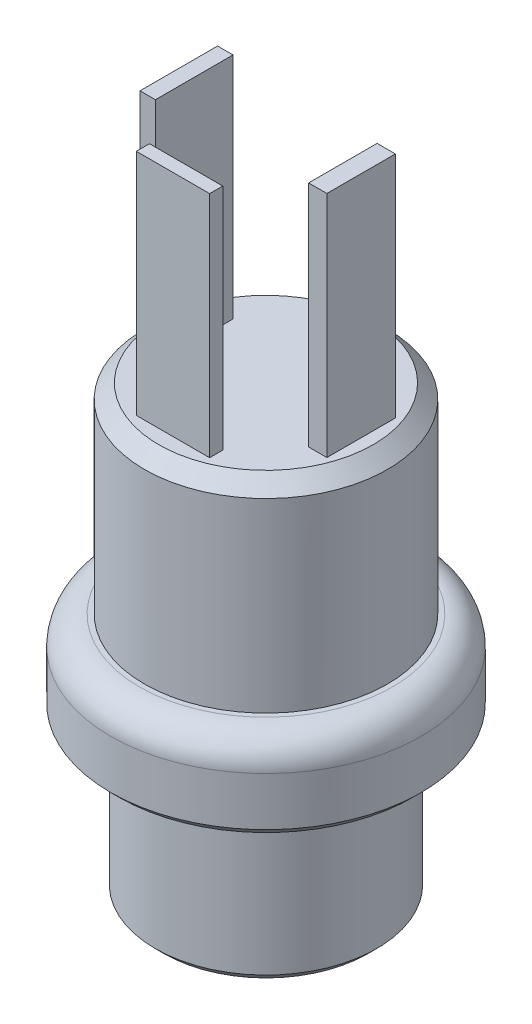
ISO-10303-21;
HEADER;
FILE_DESCRIPTION(('STEP AP214'),'2;1');
FILE_NAME('part.step','',(''),(''),'','','');
FILE_SCHEMA(('AUTOMOTIVE_DESIGN { 1 0 10303 214 1 1 1 1 }'));
ENDSEC;
DATA;
#1=APPLICATION_CONTEXT('core data for automotive mechanical design processes');
#2=APPLICATION_PROTOCOL_DEFINITION('international standard','automotive_design',2000,#1);
#3=PRODUCT_CONTEXT('',#1,'mechanical');
#4=PRODUCT('Part','Part','',(#3));
#5=PRODUCT_RELATED_PRODUCT_CATEGORY('part','',(#4));
#6=PRODUCT_DEFINITION_FORMATION('','',#4);
#7=PRODUCT_DEFINITION_CONTEXT('part definition',#1,'design');
#8=PRODUCT_DEFINITION('design','',#6,#7);
#9=PRODUCT_DEFINITION_SHAPE('','',#8);
#10=(LENGTH_UNIT() NAMED_UNIT(*) SI_UNIT(.MILLI.,.METRE.));
#11=(NAMED_UNIT(*) PLANE_ANGLE_UNIT() SI_UNIT($,.RADIAN.));
#12=(NAMED_UNIT(*) SI_UNIT($,.STERADIAN.) SOLID_ANGLE_UNIT());
#13=UNCERTAINTY_MEASURE_WITH_UNIT(LENGTH_MEASURE(1.E-05),#10,'distance_accuracy_value','');
#14=(GEOMETRIC_REPRESENTATION_CONTEXT(3) GLOBAL_UNCERTAINTY_ASSIGNED_CONTEXT((#13)) GLOBAL_UNIT_ASSIGNED_CONTEXT((#10,
#11,#12)) REPRESENTATION_CONTEXT('',''));
#15=CARTESIAN_POINT('',(0.,0.,0.));
#16=DIRECTION('',(0.,0.,1.));
#17=DIRECTION('',(1.,0.,0.));
#18=AXIS2_PLACEMENT_3D('',#15,#16,#17);
#19=CARTESIAN_POINT('',(4.25,13.,0.));
#20=DIRECTION('',(0.,-1.,0.));
#21=DIRECTION('',(0.,0.,-1.));
#22=AXIS2_PLACEMENT_3D('',#19,#20,#21);
#23=PLANE('',#22);
#24=DIRECTION('',(0.,0.,1.));
#25=VECTOR('',#24,1.);
#26=CARTESIAN_POINT('',(2.68966055315949,13.,1.19762250975551));
#27=LINE('',#26,#25);
#28=CARTESIAN_POINT('',(2.68966055315949,13.,-1.19762250975551));
#29=VERTEX_POINT('',#28);
#30=CARTESIAN_POINT('',(2.68966055315949,13.,1.19762250975551));
#31=VERTEX_POINT('',#30);
#32=EDGE_CURVE('E147',#29,#31,#27,.T.);
#33=ORIENTED_EDGE('',*,*,#32,.F.);
#34=DIRECTION('',(-1.,0.,0.));
#35=VECTOR('',#34,1.);
#36=CARTESIAN_POINT('',(3.32839255836246,13.,-1.19762250975551));
#37=LINE('',#36,#35);
#38=CARTESIAN_POINT('',(3.32839255836246,13.,-1.19762250975551));
#39=VERTEX_POINT('',#38);
#40=EDGE_CURVE('E160',#39,#29,#37,.T.);
#41=ORIENTED_EDGE('',*,*,#40,.F.);
#42=DIRECTION('',(0.,0.,-1.));
#43=VECTOR('',#42,1.);
#44=CARTESIAN_POINT('',(3.32839255836246,13.,1.19762250975551));
#45=LINE('',#44,#43);
#46=CARTESIAN_POINT('',(3.32839255836246,13.,1.19762250975551));
#47=VERTEX_POINT('',#46);
#48=EDGE_CURVE('E169',#47,#39,#45,.T.);
#49=ORIENTED_EDGE('',*,*,#48,.F.);
#50=DIRECTION('',(1.,0.,0.));
#51=VECTOR('',#50,1.);
#52=CARTESIAN_POINT('',(3.32839255836246,13.,1.19762250975551));
#53=LINE('',#52,#51);
#54=EDGE_CURVE('E150',#31,#47,#53,.T.);
#55=ORIENTED_EDGE('',*,*,#54,.F.);
#56=EDGE_LOOP('',(#33,#41,#49,#55));
#57=FACE_BOUND('',#56,.T.);
#58=CARTESIAN_POINT('',(0.,13.,0.));
#59=DIRECTION('',(0.,-1.,0.));
#60=DIRECTION('',(0.,0.,-1.));
#61=AXIS2_PLACEMENT_3D('',#58,#59,#60);
#62=CIRCLE('',#61,3.74999999999999);
#63=CARTESIAN_POINT('',(0.,13.,-3.74999999999999));
#64=VERTEX_POINT('',#63);
#65=EDGE_CURVE('E45',#64,#64,#62,.F.);
#66=ORIENTED_EDGE('',*,*,#65,.T.);
#67=EDGE_LOOP('',(#66));
#68=FACE_BOUND('',#67,.T.);
#69=DIRECTION('',(0.,0.,1.));
#70=VECTOR('',#69,1.);
#71=CARTESIAN_POINT('',(-1.28245410419665,13.,3.25354115150283));
#72=LINE('',#71,#70);
#73=CARTESIAN_POINT('',(-1.28245410419665,13.,2.79445252276316));
#74=VERTEX_POINT('',#73);
#75=CARTESIAN_POINT('',(-1.28245410419665,13.,3.25354115150283));
#76=VERTEX_POINT('',#75);
#77=EDGE_CURVE('E185',#74,#76,#72,.T.);
#78=ORIENTED_EDGE('',*,*,#77,.F.);
#79=DIRECTION('',(-1.,0.,0.));
#80=VECTOR('',#79,1.);
#81=CARTESIAN_POINT('',(1.28245410419665,13.,2.79445252276316));
#82=LINE('',#81,#80);
#83=CARTESIAN_POINT('',(1.28245410419665,13.,2.79445252276316));
#84=VERTEX_POINT('',#83);
#85=EDGE_CURVE('E190',#84,#74,#82,.T.);
#86=ORIENTED_EDGE('',*,*,#85,.F.);
#87=DIRECTION('',(0.,0.,-1.));
#88=VECTOR('',#87,1.);
#89=CARTESIAN_POINT('',(1.28245410419665,13.,3.25354115150283));
#90=LINE('',#89,#88);
#91=CARTESIAN_POINT('',(1.28245410419665,13.,3.25354115150283));
#92=VERTEX_POINT('',#91);
#93=EDGE_CURVE('E202',#92,#84,#90,.T.);
#94=ORIENTED_EDGE('',*,*,#93,.F.);
#95=DIRECTION('',(1.,0.,0.));
#96=VECTOR('',#95,1.);
#97=CARTESIAN_POINT('',(1.28245410419665,13.,3.25354115150283));
#98=LINE('',#97,#96);
#99=EDGE_CURVE('E199',#76,#92,#98,.T.);
#100=ORIENTED_EDGE('',*,*,#99,.F.);
#101=EDGE_LOOP('',(#78,#86,#94,#100));
#102=FACE_BOUND('',#101,.T.);
#103=DIRECTION('',(0.,0.,1.));
#104=VECTOR('',#103,1.);
#105=CARTESIAN_POINT('',(-3.04894730608615,13.,1.3573055110563));
#106=LINE('',#105,#104);
#107=CARTESIAN_POINT('',(-3.04894730608615,13.,-1.3573055110563));
#108=VERTEX_POINT('',#107);
#109=CARTESIAN_POINT('',(-3.04894730608615,13.,1.3573055110563));
#110=VERTEX_POINT('',#109);
#111=EDGE_CURVE('E146',#108,#110,#106,.T.);
#112=ORIENTED_EDGE('',*,*,#111,.F.);
#113=DIRECTION('',(-1.,0.,0.));
#114=VECTOR('',#113,1.);
#115=CARTESIAN_POINT('',(-2.51001717669614,13.,-1.3573055110563));
#116=LINE('',#115,#114);
#117=CARTESIAN_POINT('',(-2.51001717669614,13.,-1.3573055110563));
#118=VERTEX_POINT('',#117);
#119=EDGE_CURVE('E143',#118,#108,#116,.T.);
#120=ORIENTED_EDGE('',*,*,#119,.F.);
#121=DIRECTION('',(0.,0.,-1.));
#122=VECTOR('',#121,1.);
#123=CARTESIAN_POINT('',(-2.51001717669614,13.,1.3573055110563));
#124=LINE('',#123,#122);
#125=CARTESIAN_POINT('',(-2.51001717669614,13.,1.3573055110563));
#126=VERTEX_POINT('',#125);
#127=EDGE_CURVE('E57',#126,#118,#124,.T.);
#128=ORIENTED_EDGE('',*,*,#127,.F.);
#129=DIRECTION('',(1.,0.,0.));
#130=VECTOR('',#129,1.);
#131=CARTESIAN_POINT('',(-2.51001717669614,13.,1.3573055110563));
#132=LINE('',#131,#130);
#133=EDGE_CURVE('E52',#110,#126,#132,.T.);
#134=ORIENTED_EDGE('',*,*,#133,.F.);
#135=EDGE_LOOP('',(#112,#120,#128,#134));
#136=FACE_BOUND('',#135,.T.);
#137=ADVANCED_FACE('F36',(#57,#68,#102,#136),#23,.F.);
#138=CARTESIAN_POINT('',(0.,0.,0.));
#139=DIRECTION('',(0.,1.,0.));
#140=DIRECTION('',(0.,0.,1.));
#141=AXIS2_PLACEMENT_3D('',#138,#139,#140);
#142=CYLINDRICAL_SURFACE('',#141,1.00000000000006);
#143=CARTESIAN_POINT('',(0.,1.,0.));
#144=DIRECTION('',(0.,1.,0.));
#145=DIRECTION('',(0.,0.,1.));
#146=AXIS2_PLACEMENT_3D('',#143,#144,#145);
#147=CIRCLE('',#146,1.00000000000006);
#148=CARTESIAN_POINT('',(0.,1.,1.00000000000006));
#149=VERTEX_POINT('',#148);
#150=EDGE_CURVE('E230',#149,#149,#147,.T.);
#151=ORIENTED_EDGE('',*,*,#150,.T.);
#152=EDGE_LOOP('',(#151));
#153=FACE_BOUND('',#152,.T.);
#154=CARTESIAN_POINT('',(0.,6.,0.));
#155=DIRECTION('',(0.,1.,0.));
#156=DIRECTION('',(0.,0.,1.));
#157=AXIS2_PLACEMENT_3D('',#154,#155,#156);
#158=CIRCLE('',#157,1.);
#159=CARTESIAN_POINT('',(0.,6.,1.));
#160=VERTEX_POINT('',#159);
#161=EDGE_CURVE('E227',#160,#160,#158,.T.);
#162=ORIENTED_EDGE('',*,*,#161,.F.);
#163=EDGE_LOOP('',(#162));
#164=FACE_BOUND('',#163,.T.);
#165=ADVANCED_FACE('F276',(#153,#164),#142,.T.);
#166=CARTESIAN_POINT('',(1.,6.,0.));
#167=DIRECTION('',(0.,1.,0.));
#168=DIRECTION('',(0.,0.,1.));
#169=AXIS2_PLACEMENT_3D('',#166,#167,#168);
#170=PLANE('',#169);
#171=CARTESIAN_POINT('',(0.,6.,0.));
#172=DIRECTION('',(0.,1.,0.));
#173=DIRECTION('',(0.,0.,1.));
#174=AXIS2_PLACEMENT_3D('',#171,#172,#173);
#175=CIRCLE('',#174,2.75);
#176=CARTESIAN_POINT('',(0.,6.,2.75));
#177=VERTEX_POINT('',#176);
#178=EDGE_CURVE('E224',#177,#177,#175,.T.);
#179=ORIENTED_EDGE('',*,*,#178,.F.);
#180=EDGE_LOOP('',(#179));
#181=FACE_BOUND('',#180,.T.);
#182=ORIENTED_EDGE('',*,*,#161,.T.);
#183=EDGE_LOOP('',(#182));
#184=FACE_BOUND('',#183,.T.);
#185=ADVANCED_FACE('F282',(#181,#184),#170,.F.);
#186=CARTESIAN_POINT('',(0.,0.,0.));
#187=DIRECTION('',(0.,1.,0.));
#188=DIRECTION('',(0.,0.,1.));
#189=AXIS2_PLACEMENT_3D('',#186,#187,#188);
#190=CYLINDRICAL_SURFACE('',#189,2.75);
#191=CARTESIAN_POINT('',(0.,-2.2,0.));
#192=DIRECTION('',(0.,1.,0.));
#193=DIRECTION('',(0.,0.,1.));
#194=AXIS2_PLACEMENT_3D('',#191,#192,#193);
#195=CIRCLE('',#194,2.75);
#196=CARTESIAN_POINT('',(0.,-2.2,2.75));
#197=VERTEX_POINT('',#196);
#198=EDGE_CURVE('E248',#197,#197,#195,.F.);
#199=ORIENTED_EDGE('',*,*,#198,.T.);
#200=EDGE_LOOP('',(#199));
#201=FACE_BOUND('',#200,.T.);
#202=ORIENTED_EDGE('',*,*,#178,.T.);
#203=EDGE_LOOP('',(#202));
#204=FACE_BOUND('',#203,.T.);
#205=ADVANCED_FACE('F311',(#201,#204),#190,.F.);
#206=CARTESIAN_POINT('',(2.75,-2.5,0.));
#207=DIRECTION('',(0.,1.,0.));
#208=DIRECTION('',(0.,0.,1.));
#209=AXIS2_PLACEMENT_3D('',#206,#207,#208);
#210=PLANE('',#209);
#211=CARTESIAN_POINT('',(0.,-2.5,0.));
#212=DIRECTION('',(0.,1.,0.));
#213=DIRECTION('',(0.,0.,1.));
#214=AXIS2_PLACEMENT_3D('',#211,#212,#213);
#215=CIRCLE('',#214,3.57500000000001);
#216=CARTESIAN_POINT('',(0.,-2.5,3.57500000000001));
#217=VERTEX_POINT('',#216);
#218=EDGE_CURVE('E245',#217,#217,#215,.F.);
#219=ORIENTED_EDGE('',*,*,#218,.T.);
#220=EDGE_LOOP('',(#219));
#221=FACE_BOUND('',#220,.T.);
#222=CARTESIAN_POINT('',(0.,-2.5,0.));
#223=DIRECTION('',(0.,1.,0.));
#224=DIRECTION('',(0.,0.,1.));
#225=AXIS2_PLACEMENT_3D('',#222,#223,#224);
#226=CIRCLE('',#225,3.05);
#227=CARTESIAN_POINT('',(0.,-2.5,3.05));
#228=VERTEX_POINT('',#227);
#229=EDGE_CURVE('E242',#228,#228,#226,.T.);
#230=ORIENTED_EDGE('',*,*,#229,.T.);
#231=EDGE_LOOP('',(#230));
#232=FACE_BOUND('',#231,.T.);
#233=ADVANCED_FACE('F307',(#221,#232),#210,.F.);
#234=CARTESIAN_POINT('',(0.,0.,0.));
#235=DIRECTION('',(0.,1.,0.));
#236=DIRECTION('',(0.,0.,1.));
#237=AXIS2_PLACEMENT_3D('',#234,#235,#236);
#238=CYLINDRICAL_SURFACE('',#237,3.875);
#239=CARTESIAN_POINT('',(0.,-2.20000000000001,0.));
#240=DIRECTION('',(0.,1.,0.));
#241=DIRECTION('',(0.,0.,1.));
#242=AXIS2_PLACEMENT_3D('',#239,#240,#241);
#243=CIRCLE('',#242,3.875);
#244=CARTESIAN_POINT('',(0.,-2.20000000000001,3.875));
#245=VERTEX_POINT('',#244);
#246=EDGE_CURVE('E239',#245,#245,#243,.T.);
#247=ORIENTED_EDGE('',*,*,#246,.T.);
#248=EDGE_LOOP('',(#247));
#249=FACE_BOUND('',#248,.T.);
#250=CARTESIAN_POINT('',(0.,3.,0.));
#251=DIRECTION('',(0.,1.,0.));
#252=DIRECTION('',(0.,0.,1.));
#253=AXIS2_PLACEMENT_3D('',#250,#251,#252);
#254=CIRCLE('',#253,3.875);
#255=CARTESIAN_POINT('',(0.,3.,3.875));
#256=VERTEX_POINT('',#255);
#257=EDGE_CURVE('E221',#256,#256,#254,.T.);
#258=ORIENTED_EDGE('',*,*,#257,.F.);
#259=EDGE_LOOP('',(#258));
#260=FACE_BOUND('',#259,.T.);
#261=ADVANCED_FACE('F303',(#249,#260),#238,.T.);
#262=CARTESIAN_POINT('',(3.875,3.,0.));
#263=DIRECTION('',(0.,1.,0.));
#264=DIRECTION('',(0.,0.,1.));
#265=AXIS2_PLACEMENT_3D('',#262,#263,#264);
#266=PLANE('',#265);
#267=CARTESIAN_POINT('',(0.,3.,0.));
#268=DIRECTION('',(0.,1.,0.));
#269=DIRECTION('',(0.,0.,1.));
#270=AXIS2_PLACEMENT_3D('',#267,#268,#269);
#271=CIRCLE('',#270,5.125);
#272=CARTESIAN_POINT('',(0.,3.,5.125));
#273=VERTEX_POINT('',#272);
#274=EDGE_CURVE('E254',#273,#273,#271,.F.);
#275=ORIENTED_EDGE('',*,*,#274,.T.);
#276=EDGE_LOOP('',(#275));
#277=FACE_BOUND('',#276,.T.);
#278=ORIENTED_EDGE('',*,*,#257,.T.);
#279=EDGE_LOOP('',(#278));
#280=FACE_BOUND('',#279,.T.);
#281=ADVANCED_FACE('F299',(#277,#280),#266,.F.);
#282=CARTESIAN_POINT('',(0.,0.,0.));
#283=DIRECTION('',(0.,1.,0.));
#284=DIRECTION('',(0.,0.,1.));
#285=AXIS2_PLACEMENT_3D('',#282,#283,#284);
#286=CYLINDRICAL_SURFACE('',#285,5.425);
#287=CARTESIAN_POINT('',(0.,3.3,0.));
#288=DIRECTION('',(0.,1.,0.));
#289=DIRECTION('',(0.,0.,1.));
#290=AXIS2_PLACEMENT_3D('',#287,#288,#289);
#291=CIRCLE('',#290,5.425);
#292=CARTESIAN_POINT('',(0.,3.3,5.425));
#293=VERTEX_POINT('',#292);
#294=EDGE_CURVE('E251',#293,#293,#291,.T.);
#295=ORIENTED_EDGE('',*,*,#294,.T.);
#296=EDGE_LOOP('',(#295));
#297=FACE_BOUND('',#296,.T.);
#298=CARTESIAN_POINT('',(0.,5.,0.));
#299=DIRECTION('',(0.,-1.,0.));
#300=DIRECTION('',(0.,0.,-1.));
#301=AXIS2_PLACEMENT_3D('',#298,#299,#300);
#302=CIRCLE('',#301,5.425);
#303=CARTESIAN_POINT('',(0.,5.,-5.425));
#304=VERTEX_POINT('',#303);
#305=EDGE_CURVE('E236',#304,#304,#302,.T.);
#306=ORIENTED_EDGE('',*,*,#305,.T.);
#307=EDGE_LOOP('',(#306));
#308=FACE_BOUND('',#307,.T.);
#309=ADVANCED_FACE('F295',(#297,#308),#286,.T.);
#310=CARTESIAN_POINT('',(5.425,6.,0.));
#311=DIRECTION('',(0.,-1.,0.));
#312=DIRECTION('',(0.,0.,-1.));
#313=AXIS2_PLACEMENT_3D('',#310,#311,#312);
#314=PLANE('',#313);
#315=CARTESIAN_POINT('',(0.,6.,0.));
#316=DIRECTION('',(0.,-1.,0.));
#317=DIRECTION('',(0.,0.,-1.));
#318=AXIS2_PLACEMENT_3D('',#315,#316,#317);
#319=CIRCLE('',#318,4.425);
#320=CARTESIAN_POINT('',(0.,6.,-4.425));
#321=VERTEX_POINT('',#320);
#322=EDGE_CURVE('E233',#321,#321,#319,.F.);
#323=ORIENTED_EDGE('',*,*,#322,.T.);
#324=EDGE_LOOP('',(#323));
#325=FACE_BOUND('',#324,.T.);
#326=CARTESIAN_POINT('',(0.,6.,0.));
#327=DIRECTION('',(0.,1.,0.));
#328=DIRECTION('',(0.,0.,1.));
#329=AXIS2_PLACEMENT_3D('',#326,#327,#328);
#330=CIRCLE('',#329,4.25);
#331=CARTESIAN_POINT('',(0.,6.,4.25));
#332=VERTEX_POINT('',#331);
#333=EDGE_CURVE('E218',#332,#332,#330,.T.);
#334=ORIENTED_EDGE('',*,*,#333,.F.);
#335=EDGE_LOOP('',(#334));
#336=FACE_BOUND('',#335,.T.);
#337=ADVANCED_FACE('F291',(#325,#336),#314,.F.);
#338=CARTESIAN_POINT('',(0.,0.,0.));
#339=DIRECTION('',(0.,1.,0.));
#340=DIRECTION('',(0.,0.,1.));
#341=AXIS2_PLACEMENT_3D('',#338,#339,#340);
#342=CYLINDRICAL_SURFACE('',#341,4.25);
#343=CARTESIAN_POINT('',(0.,12.5,0.));
#344=DIRECTION('',(0.,-1.,0.));
#345=DIRECTION('',(0.,0.,-1.));
#346=AXIS2_PLACEMENT_3D('',#343,#344,#345);
#347=CIRCLE('',#346,4.25);
#348=CARTESIAN_POINT('',(0.,12.5,-4.25));
#349=VERTEX_POINT('',#348);
#350=EDGE_CURVE('E11',#349,#349,#347,.T.);
#351=ORIENTED_EDGE('',*,*,#350,.T.);
#352=EDGE_LOOP('',(#351));
#353=FACE_BOUND('',#352,.T.);
#354=ORIENTED_EDGE('',*,*,#333,.T.);
#355=EDGE_LOOP('',(#354));
#356=FACE_BOUND('',#355,.T.);
#357=ADVANCED_FACE('F287',(#353,#356),#342,.T.);
#358=CARTESIAN_POINT('',(0.,1.,0.));
#359=DIRECTION('',(0.,1.,0.));
#360=DIRECTION('',(0.,0.,1.));
#361=AXIS2_PLACEMENT_3D('',#358,#359,#360);
#362=SPHERICAL_SURFACE('',#361,1.);
#363=ORIENTED_EDGE('',*,*,#150,.F.);
#364=EDGE_LOOP('',(#363));
#365=FACE_BOUND('',#364,.T.);
#366=ADVANCED_FACE('F290',(#365),#362,.T.);
#367=CARTESIAN_POINT('',(0.,5.,0.));
#368=DIRECTION('',(0.,-1.,0.));
#369=DIRECTION('',(0.,0.,-1.));
#370=AXIS2_PLACEMENT_3D('',#367,#368,#369);
#371=TOROIDAL_SURFACE('',#370,4.425,1.);
#372=ORIENTED_EDGE('',*,*,#305,.F.);
#373=EDGE_LOOP('',(#372));
#374=FACE_BOUND('',#373,.T.);
#375=ORIENTED_EDGE('',*,*,#322,.F.);
#376=EDGE_LOOP('',(#375));
#377=FACE_BOUND('',#376,.T.);
#378=ADVANCED_FACE('F321',(#374,#377),#371,.T.);
#379=CARTESIAN_POINT('',(0.,-2.20000000000001,0.));
#380=DIRECTION('',(0.,1.,0.));
#381=DIRECTION('',(0.,0.,1.));
#382=AXIS2_PLACEMENT_3D('',#379,#380,#381);
#383=CONICAL_SURFACE('',#382,3.875,0.785398163397448);
#384=ORIENTED_EDGE('',*,*,#218,.F.);
#385=EDGE_LOOP('',(#384));
#386=FACE_BOUND('',#385,.T.);
#387=ORIENTED_EDGE('',*,*,#246,.F.);
#388=EDGE_LOOP('',(#387));
#389=FACE_BOUND('',#388,.T.);
#390=ADVANCED_FACE('F325',(#386,#389),#383,.T.);
#391=CARTESIAN_POINT('',(0.,-2.5,0.));
#392=DIRECTION('',(0.,-1.,0.));
#393=DIRECTION('',(0.,0.,-1.));
#394=AXIS2_PLACEMENT_3D('',#391,#392,#393);
#395=CONICAL_SURFACE('',#394,3.05,0.785398163397447);
#396=ORIENTED_EDGE('',*,*,#198,.F.);
#397=EDGE_LOOP('',(#396));
#398=FACE_BOUND('',#397,.T.);
#399=ORIENTED_EDGE('',*,*,#229,.F.);
#400=EDGE_LOOP('',(#399));
#401=FACE_BOUND('',#400,.T.);
#402=ADVANCED_FACE('F272',(#398,#401),#395,.F.);
#403=CARTESIAN_POINT('',(0.,3.3,0.));
#404=DIRECTION('',(0.,1.,0.));
#405=DIRECTION('',(0.,0.,1.));
#406=AXIS2_PLACEMENT_3D('',#403,#404,#405);
#407=CONICAL_SURFACE('',#406,5.425,0.785398163397448);
#408=CARTESIAN_POINT('',(0.,3.,5.125));
#409=CARTESIAN_POINT('',(0.,3.003125,5.128125));
#410=CARTESIAN_POINT('',(0.,3.00625,5.13125));
#411=CARTESIAN_POINT('',(0.,3.0125,5.1375));
#412=CARTESIAN_POINT('',(0.,3.015625,5.140625));
#413=CARTESIAN_POINT('',(0.,3.021875,5.146875));
#414=CARTESIAN_POINT('',(0.,3.025,5.15));
#415=CARTESIAN_POINT('',(0.,3.03125,5.15625));
#416=CARTESIAN_POINT('',(0.,3.034375,5.159375));
#417=CARTESIAN_POINT('',(0.,3.040625,5.165625));
#418=CARTESIAN_POINT('',(0.,3.04375,5.16875));
#419=CARTESIAN_POINT('',(0.,3.05,5.175));
#420=CARTESIAN_POINT('',(0.,3.053125,5.178125));
#421=CARTESIAN_POINT('',(0.,3.059375,5.184375));
#422=CARTESIAN_POINT('',(0.,3.0625,5.1875));
#423=CARTESIAN_POINT('',(0.,3.06875,5.19375));
#424=CARTESIAN_POINT('',(0.,3.071875,5.196875));
#425=CARTESIAN_POINT('',(0.,3.078125,5.203125));
#426=CARTESIAN_POINT('',(0.,3.08125,5.20625));
#427=CARTESIAN_POINT('',(0.,3.0875,5.2125));
#428=CARTESIAN_POINT('',(0.,3.090625,5.215625));
#429=CARTESIAN_POINT('',(0.,3.096875,5.221875));
#430=CARTESIAN_POINT('',(0.,3.1,5.225));
#431=CARTESIAN_POINT('',(0.,3.10625,5.23125));
#432=CARTESIAN_POINT('',(0.,3.109375,5.234375));
#433=CARTESIAN_POINT('',(0.,3.115625,5.240625));
#434=CARTESIAN_POINT('',(0.,3.11875,5.24375));
#435=CARTESIAN_POINT('',(0.,3.125,5.25));
#436=CARTESIAN_POINT('',(0.,3.128125,5.253125));
#437=CARTESIAN_POINT('',(0.,3.134375,5.259375));
#438=CARTESIAN_POINT('',(0.,3.1375,5.2625));
#439=CARTESIAN_POINT('',(0.,3.14375,5.26875));
#440=CARTESIAN_POINT('',(0.,3.146875,5.271875));
#441=CARTESIAN_POINT('',(0.,3.153125,5.278125));
#442=CARTESIAN_POINT('',(0.,3.15625,5.28125));
#443=CARTESIAN_POINT('',(0.,3.1625,5.2875));
#444=CARTESIAN_POINT('',(0.,3.165625,5.290625));
#445=CARTESIAN_POINT('',(0.,3.171875,5.296875));
#446=CARTESIAN_POINT('',(0.,3.175,5.3));
#447=CARTESIAN_POINT('',(0.,3.18125,5.30625));
#448=CARTESIAN_POINT('',(0.,3.184375,5.309375));
#449=CARTESIAN_POINT('',(0.,3.190625,5.315625));
#450=CARTESIAN_POINT('',(0.,3.19375,5.31875));
#451=CARTESIAN_POINT('',(0.,3.2,5.325));
#452=CARTESIAN_POINT('',(0.,3.203125,5.328125));
#453=CARTESIAN_POINT('',(0.,3.209375,5.334375));
#454=CARTESIAN_POINT('',(0.,3.2125,5.3375));
#455=CARTESIAN_POINT('',(0.,3.21875,5.34375));
#456=CARTESIAN_POINT('',(0.,3.221875,5.346875));
#457=CARTESIAN_POINT('',(0.,3.228125,5.353125));
#458=CARTESIAN_POINT('',(0.,3.23125,5.35625));
#459=CARTESIAN_POINT('',(0.,3.2375,5.3625));
#460=CARTESIAN_POINT('',(0.,3.240625,5.365625));
#461=CARTESIAN_POINT('',(0.,3.246875,5.371875));
#462=CARTESIAN_POINT('',(0.,3.25,5.375));
#463=CARTESIAN_POINT('',(0.,3.25625,5.38125));
#464=CARTESIAN_POINT('',(0.,3.259375,5.384375));
#465=CARTESIAN_POINT('',(0.,3.265625,5.390625));
#466=CARTESIAN_POINT('',(0.,3.26875,5.39375));
#467=CARTESIAN_POINT('',(0.,3.275,5.4));
#468=CARTESIAN_POINT('',(0.,3.278125,5.403125));
#469=CARTESIAN_POINT('',(0.,3.284375,5.409375));
#470=CARTESIAN_POINT('',(0.,3.2875,5.4125));
#471=CARTESIAN_POINT('',(0.,3.29375,5.41875));
#472=CARTESIAN_POINT('',(0.,3.296875,5.421875));
#473=CARTESIAN_POINT('',(0.,3.3,5.425));
#474=B_SPLINE_CURVE_WITH_KNOTS('',3,(#408,#409,#410,#411,#412,#413,#414,#415,#416,#417,#418,
#419,#420,#421,#422,#423,#424,#425,#426,#427,#428,#429,#430,#431,#432,#433,#434,#435,#436,#437,
#438,#439,#440,#441,#442,#443,#444,#445,#446,#447,#448,#449,#450,#451,#452,#453,#454,#455,#456,
#457,#458,#459,#460,#461,#462,#463,#464,#465,#466,#467,#468,#469,#470,#471,#472,#473),
.UNSPECIFIED.,.F.,.F.,(4,2,2,2,2,2,2,2,2,2,2,2,2,2,2,2,2,2,2,2,2,2,2,2,2,2,2,2,2,2,2,2,4),(0.,
0.0132582521472475,0.0265165042944954,0.0397747564417429,0.0530330085889911,0.0662912607362389,
0.0795495128834864,0.0928077650307343,0.106066017177982,0.11932426932523,0.132582521472478,
0.145840773619725,0.159099025766973,0.172357277914221,0.185615530061469,0.198873782208717,
0.212132034355965,0.225390286503212,0.23864853865046,0.251906790797708,0.265165042944956,
0.278423295092203,0.291681547239451,0.304939799386699,0.318198051533947,0.331456303681194,
0.344714555828442,0.35797280797569,0.371231060122938,0.384489312270186,0.397747564417434,
0.411005816564682,0.42426406871193),.UNSPECIFIED.);
#475=EDGE_CURVE('BSEAM263',#273,#293,#474,.T.);
#476=ORIENTED_EDGE('',*,*,#274,.F.);
#477=ORIENTED_EDGE('',*,*,#294,.F.);
#478=ORIENTED_EDGE('',*,*,#475,.T.);
#479=ORIENTED_EDGE('',*,*,#475,.F.);
#480=EDGE_LOOP('',(#476,#478,#477,#479));
#481=FACE_BOUND('',#480,.T.);
#482=ADVANCED_FACE('F263',(#481),#407,.T.);
#483=CARTESIAN_POINT('',(0.,13.,0.));
#484=DIRECTION('',(0.,-1.,0.));
#485=DIRECTION('',(0.,0.,-1.));
#486=AXIS2_PLACEMENT_3D('',#483,#484,#485);
#487=CONICAL_SURFACE('',#486,3.74999999999999,0.785398163397446);
#488=ORIENTED_EDGE('',*,*,#350,.F.);
#489=EDGE_LOOP('',(#488));
#490=FACE_BOUND('',#489,.T.);
#491=ORIENTED_EDGE('',*,*,#65,.F.);
#492=EDGE_LOOP('',(#491));
#493=FACE_BOUND('',#492,.T.);
#494=ADVANCED_FACE('F39',(#490,#493),#487,.T.);
#495=CARTESIAN_POINT('',(-1.28245410419665,21.,3.25354115150283));
#496=DIRECTION('',(1.,0.,0.));
#497=DIRECTION('',(0.,0.,-1.));
#498=AXIS2_PLACEMENT_3D('',#495,#496,#497);
#499=PLANE('',#498);
#500=ORIENTED_EDGE('',*,*,#77,.T.);
#501=DIRECTION('',(0.,-1.,0.));
#502=VECTOR('',#501,1.);
#503=CARTESIAN_POINT('',(-1.28245410419665,21.,3.25354115150283));
#504=LINE('',#503,#502);
#505=CARTESIAN_POINT('',(-1.28245410419665,21.,3.25354115150283));
#506=VERTEX_POINT('',#505);
#507=EDGE_CURVE('E215',#506,#76,#504,.T.);
#508=ORIENTED_EDGE('',*,*,#507,.F.);
#509=DIRECTION('',(0.,0.,1.));
#510=VECTOR('',#509,1.);
#511=CARTESIAN_POINT('',(-1.28245410419665,21.,3.25354115150283));
#512=LINE('',#511,#510);
#513=CARTESIAN_POINT('',(-1.28245410419665,21.,2.79445252276316));
#514=VERTEX_POINT('',#513);
#515=EDGE_CURVE('E186',#514,#506,#512,.T.);
#516=ORIENTED_EDGE('',*,*,#515,.F.);
#517=DIRECTION('',(0.,-1.,0.));
#518=VECTOR('',#517,1.);
#519=CARTESIAN_POINT('',(-1.28245410419665,21.,2.79445252276316));
#520=LINE('',#519,#518);
#521=EDGE_CURVE('E196',#514,#74,#520,.T.);
#522=ORIENTED_EDGE('',*,*,#521,.T.);
#523=EDGE_LOOP('',(#500,#508,#516,#522));
#524=FACE_BOUND('',#523,.T.);
#525=ADVANCED_FACE('F262',(#524),#499,.F.);
#526=CARTESIAN_POINT('',(1.28245410419665,21.,3.25354115150283));
#527=DIRECTION('',(0.,0.,-1.));
#528=DIRECTION('',(-1.,0.,0.));
#529=AXIS2_PLACEMENT_3D('',#526,#527,#528);
#530=PLANE('',#529);
#531=ORIENTED_EDGE('',*,*,#99,.T.);
#532=DIRECTION('',(0.,-1.,0.));
#533=VECTOR('',#532,1.);
#534=CARTESIAN_POINT('',(1.28245410419665,21.,3.25354115150283));
#535=LINE('',#534,#533);
#536=CARTESIAN_POINT('',(1.28245410419665,21.,3.25354115150283));
#537=VERTEX_POINT('',#536);
#538=EDGE_CURVE('E212',#537,#92,#535,.T.);
#539=ORIENTED_EDGE('',*,*,#538,.F.);
#540=DIRECTION('',(1.,0.,0.));
#541=VECTOR('',#540,1.);
#542=CARTESIAN_POINT('',(1.28245410419665,21.,3.25354115150283));
#543=LINE('',#542,#541);
#544=EDGE_CURVE('E189',#506,#537,#543,.T.);
#545=ORIENTED_EDGE('',*,*,#544,.F.);
#546=ORIENTED_EDGE('',*,*,#507,.T.);
#547=EDGE_LOOP('',(#531,#539,#545,#546));
#548=FACE_BOUND('',#547,.T.);
#549=ADVANCED_FACE('F269',(#548),#530,.F.);
#550=CARTESIAN_POINT('',(1.28245410419665,21.,3.25354115150283));
#551=DIRECTION('',(-1.,0.,0.));
#552=DIRECTION('',(0.,0.,1.));
#553=AXIS2_PLACEMENT_3D('',#550,#551,#552);
#554=PLANE('',#553);
#555=ORIENTED_EDGE('',*,*,#93,.T.);
#556=DIRECTION('',(0.,-1.,0.));
#557=VECTOR('',#556,1.);
#558=CARTESIAN_POINT('',(1.28245410419665,21.,2.79445252276316));
#559=LINE('',#558,#557);
#560=CARTESIAN_POINT('',(1.28245410419665,21.,2.79445252276316));
#561=VERTEX_POINT('',#560);
#562=EDGE_CURVE('E209',#561,#84,#559,.T.);
#563=ORIENTED_EDGE('',*,*,#562,.F.);
#564=DIRECTION('',(0.,0.,-1.));
#565=VECTOR('',#564,1.);
#566=CARTESIAN_POINT('',(1.28245410419665,21.,3.25354115150283));
#567=LINE('',#566,#565);
#568=EDGE_CURVE('E192',#537,#561,#567,.T.);
#569=ORIENTED_EDGE('',*,*,#568,.F.);
#570=ORIENTED_EDGE('',*,*,#538,.T.);
#571=EDGE_LOOP('',(#555,#563,#569,#570));
#572=FACE_BOUND('',#571,.T.);
#573=ADVANCED_FACE('F391',(#572),#554,.F.);
#574=CARTESIAN_POINT('',(1.28245410419665,21.,2.79445252276316));
#575=DIRECTION('',(0.,0.,1.));
#576=DIRECTION('',(1.,0.,0.));
#577=AXIS2_PLACEMENT_3D('',#574,#575,#576);
#578=PLANE('',#577);
#579=ORIENTED_EDGE('',*,*,#85,.T.);
#580=ORIENTED_EDGE('',*,*,#521,.F.);
#581=DIRECTION('',(-1.,0.,0.));
#582=VECTOR('',#581,1.);
#583=CARTESIAN_POINT('',(1.28245410419665,21.,2.79445252276316));
#584=LINE('',#583,#582);
#585=EDGE_CURVE('E194',#561,#514,#584,.T.);
#586=ORIENTED_EDGE('',*,*,#585,.F.);
#587=ORIENTED_EDGE('',*,*,#562,.T.);
#588=EDGE_LOOP('',(#579,#580,#586,#587));
#589=FACE_BOUND('',#588,.T.);
#590=ADVANCED_FACE('F400',(#589),#578,.F.);
#591=CARTESIAN_POINT('',(0.,21.,0.));
#592=DIRECTION('',(0.,1.,0.));
#593=DIRECTION('',(0.,0.,1.));
#594=AXIS2_PLACEMENT_3D('',#591,#592,#593);
#595=PLANE('',#594);
#596=ORIENTED_EDGE('',*,*,#515,.T.);
#597=ORIENTED_EDGE('',*,*,#544,.T.);
#598=ORIENTED_EDGE('',*,*,#568,.T.);
#599=ORIENTED_EDGE('',*,*,#585,.T.);
#600=EDGE_LOOP('',(#596,#597,#598,#599));
#601=FACE_BOUND('',#600,.T.);
#602=ADVANCED_FACE('F410',(#601),#595,.T.);
#603=CARTESIAN_POINT('',(2.68966055315949,21.,1.19762250975551));
#604=DIRECTION('',(1.,0.,0.));
#605=DIRECTION('',(0.,0.,-1.));
#606=AXIS2_PLACEMENT_3D('',#603,#604,#605);
#607=PLANE('',#606);
#608=ORIENTED_EDGE('',*,*,#32,.T.);
#609=DIRECTION('',(0.,-1.,0.));
#610=VECTOR('',#609,1.);
#611=CARTESIAN_POINT('',(2.68966055315949,21.,1.19762250975551));
#612=LINE('',#611,#610);
#613=CARTESIAN_POINT('',(2.68966055315949,21.,1.19762250975551));
#614=VERTEX_POINT('',#613);
#615=EDGE_CURVE('E182',#614,#31,#612,.T.);
#616=ORIENTED_EDGE('',*,*,#615,.F.);
#617=DIRECTION('',(0.,0.,1.));
#618=VECTOR('',#617,1.);
#619=CARTESIAN_POINT('',(2.68966055315949,21.,1.19762250975551));
#620=LINE('',#619,#618);
#621=CARTESIAN_POINT('',(2.68966055315949,21.,-1.19762250975551));
#622=VERTEX_POINT('',#621);
#623=EDGE_CURVE('E156',#622,#614,#620,.T.);
#624=ORIENTED_EDGE('',*,*,#623,.F.);
#625=DIRECTION('',(0.,-1.,0.));
#626=VECTOR('',#625,1.);
#627=CARTESIAN_POINT('',(2.68966055315949,21.,-1.19762250975551));
#628=LINE('',#627,#626);
#629=EDGE_CURVE('E165',#622,#29,#628,.T.);
#630=ORIENTED_EDGE('',*,*,#629,.T.);
#631=EDGE_LOOP('',(#608,#616,#624,#630));
#632=FACE_BOUND('',#631,.T.);
#633=ADVANCED_FACE('F420',(#632),#607,.F.);
#634=CARTESIAN_POINT('',(3.32839255836246,21.,1.19762250975551));
#635=DIRECTION('',(0.,0.,-1.));
#636=DIRECTION('',(-1.,0.,0.));
#637=AXIS2_PLACEMENT_3D('',#634,#635,#636);
#638=PLANE('',#637);
#639=ORIENTED_EDGE('',*,*,#54,.T.);
#640=DIRECTION('',(0.,-1.,0.));
#641=VECTOR('',#640,1.);
#642=CARTESIAN_POINT('',(3.32839255836246,21.,1.19762250975551));
#643=LINE('',#642,#641);
#644=CARTESIAN_POINT('',(3.32839255836246,21.,1.19762250975551));
#645=VERTEX_POINT('',#644);
#646=EDGE_CURVE('E179',#645,#47,#643,.T.);
#647=ORIENTED_EDGE('',*,*,#646,.F.);
#648=DIRECTION('',(1.,0.,0.));
#649=VECTOR('',#648,1.);
#650=CARTESIAN_POINT('',(3.32839255836246,21.,1.19762250975551));
#651=LINE('',#650,#649);
#652=EDGE_CURVE('E159',#614,#645,#651,.T.);
#653=ORIENTED_EDGE('',*,*,#652,.F.);
#654=ORIENTED_EDGE('',*,*,#615,.T.);
#655=EDGE_LOOP('',(#639,#647,#653,#654));
#656=FACE_BOUND('',#655,.T.);
#657=ADVANCED_FACE('F430',(#656),#638,.F.);
#658=CARTESIAN_POINT('',(3.32839255836246,21.,1.19762250975551));
#659=DIRECTION('',(-1.,0.,0.));
#660=DIRECTION('',(0.,0.,1.));
#661=AXIS2_PLACEMENT_3D('',#658,#659,#660);
#662=PLANE('',#661);
#663=ORIENTED_EDGE('',*,*,#48,.T.);
#664=DIRECTION('',(0.,-1.,0.));
#665=VECTOR('',#664,1.);
#666=CARTESIAN_POINT('',(3.32839255836246,21.,-1.19762250975551));
#667=LINE('',#666,#665);
#668=CARTESIAN_POINT('',(3.32839255836246,21.,-1.19762250975551));
#669=VERTEX_POINT('',#668);
#670=EDGE_CURVE('E176',#669,#39,#667,.T.);
#671=ORIENTED_EDGE('',*,*,#670,.F.);
#672=DIRECTION('',(0.,0.,-1.));
#673=VECTOR('',#672,1.);
#674=CARTESIAN_POINT('',(3.32839255836246,21.,1.19762250975551));
#675=LINE('',#674,#673);
#676=EDGE_CURVE('E162',#645,#669,#675,.T.);
#677=ORIENTED_EDGE('',*,*,#676,.F.);
#678=ORIENTED_EDGE('',*,*,#646,.T.);
#679=EDGE_LOOP('',(#663,#671,#677,#678));
#680=FACE_BOUND('',#679,.T.);
#681=ADVANCED_FACE('F440',(#680),#662,.F.);
#682=CARTESIAN_POINT('',(3.32839255836246,21.,-1.19762250975551));
#683=DIRECTION('',(0.,0.,1.));
#684=DIRECTION('',(1.,0.,0.));
#685=AXIS2_PLACEMENT_3D('',#682,#683,#684);
#686=PLANE('',#685);
#687=ORIENTED_EDGE('',*,*,#40,.T.);
#688=ORIENTED_EDGE('',*,*,#629,.F.);
#689=DIRECTION('',(-1.,0.,0.));
#690=VECTOR('',#689,1.);
#691=CARTESIAN_POINT('',(3.32839255836246,21.,-1.19762250975551));
#692=LINE('',#691,#690);
#693=EDGE_CURVE('E164',#669,#622,#692,.T.);
#694=ORIENTED_EDGE('',*,*,#693,.F.);
#695=ORIENTED_EDGE('',*,*,#670,.T.);
#696=EDGE_LOOP('',(#687,#688,#694,#695));
#697=FACE_BOUND('',#696,.T.);
#698=ADVANCED_FACE('F450',(#697),#686,.F.);
#699=CARTESIAN_POINT('',(0.,21.,0.));
#700=DIRECTION('',(0.,1.,0.));
#701=DIRECTION('',(0.,0.,1.));
#702=AXIS2_PLACEMENT_3D('',#699,#700,#701);
#703=PLANE('',#702);
#704=ORIENTED_EDGE('',*,*,#623,.T.);
#705=ORIENTED_EDGE('',*,*,#652,.T.);
#706=ORIENTED_EDGE('',*,*,#676,.T.);
#707=ORIENTED_EDGE('',*,*,#693,.T.);
#708=EDGE_LOOP('',(#704,#705,#706,#707));
#709=FACE_BOUND('',#708,.T.);
#710=ADVANCED_FACE('F460',(#709),#703,.T.);
#711=CARTESIAN_POINT('',(-3.04894730608615,21.,1.3573055110563));
#712=DIRECTION('',(1.,0.,0.));
#713=DIRECTION('',(0.,0.,-1.));
#714=AXIS2_PLACEMENT_3D('',#711,#712,#713);
#715=PLANE('',#714);
#716=ORIENTED_EDGE('',*,*,#111,.T.);
#717=DIRECTION('',(0.,-1.,0.));
#718=VECTOR('',#717,1.);
#719=CARTESIAN_POINT('',(-3.04894730608615,21.,1.3573055110563));
#720=LINE('',#719,#718);
#721=CARTESIAN_POINT('',(-3.04894730608615,21.,1.3573055110563));
#722=VERTEX_POINT('',#721);
#723=EDGE_CURVE('E127',#722,#110,#720,.T.);
#724=ORIENTED_EDGE('',*,*,#723,.F.);
#725=DIRECTION('',(0.,0.,1.));
#726=VECTOR('',#725,1.);
#727=CARTESIAN_POINT('',(-3.04894730608615,21.,1.3573055110563));
#728=LINE('',#727,#726);
#729=CARTESIAN_POINT('',(-3.04894730608615,21.,-1.3573055110563));
#730=VERTEX_POINT('',#729);
#731=EDGE_CURVE('E134',#730,#722,#728,.T.);
#732=ORIENTED_EDGE('',*,*,#731,.F.);
#733=DIRECTION('',(0.,-1.,0.));
#734=VECTOR('',#733,1.);
#735=CARTESIAN_POINT('',(-3.04894730608615,21.,-1.3573055110563));
#736=LINE('',#735,#734);
#737=EDGE_CURVE('E520',#730,#108,#736,.T.);
#738=ORIENTED_EDGE('',*,*,#737,.T.);
#739=EDGE_LOOP('',(#716,#724,#732,#738));
#740=FACE_BOUND('',#739,.T.);
#741=ADVANCED_FACE('F145',(#740),#715,.F.);
#742=CARTESIAN_POINT('',(-2.51001717669614,21.,1.3573055110563));
#743=DIRECTION('',(0.,0.,-1.));
#744=DIRECTION('',(-1.,0.,0.));
#745=AXIS2_PLACEMENT_3D('',#742,#743,#744);
#746=PLANE('',#745);
#747=ORIENTED_EDGE('',*,*,#133,.T.);
#748=DIRECTION('',(0.,-1.,0.));
#749=VECTOR('',#748,1.);
#750=CARTESIAN_POINT('',(-2.51001717669614,21.,1.3573055110563));
#751=LINE('',#750,#749);
#752=CARTESIAN_POINT('',(-2.51001717669614,21.,1.3573055110563));
#753=VERTEX_POINT('',#752);
#754=EDGE_CURVE('E130',#753,#126,#751,.T.);
#755=ORIENTED_EDGE('',*,*,#754,.F.);
#756=DIRECTION('',(1.,0.,0.));
#757=VECTOR('',#756,1.);
#758=CARTESIAN_POINT('',(-2.51001717669614,21.,1.3573055110563));
#759=LINE('',#758,#757);
#760=EDGE_CURVE('E123',#722,#753,#759,.T.);
#761=ORIENTED_EDGE('',*,*,#760,.F.);
#762=ORIENTED_EDGE('',*,*,#723,.T.);
#763=EDGE_LOOP('',(#747,#755,#761,#762));
#764=FACE_BOUND('',#763,.T.);
#765=ADVANCED_FACE('F125',(#764),#746,.F.);
#766=CARTESIAN_POINT('',(-2.51001717669614,21.,1.3573055110563));
#767=DIRECTION('',(-1.,0.,0.));
#768=DIRECTION('',(0.,0.,1.));
#769=AXIS2_PLACEMENT_3D('',#766,#767,#768);
#770=PLANE('',#769);
#771=ORIENTED_EDGE('',*,*,#127,.T.);
#772=DIRECTION('',(0.,-1.,0.));
#773=VECTOR('',#772,1.);
#774=CARTESIAN_POINT('',(-2.51001717669614,21.,-1.3573055110563));
#775=LINE('',#774,#773);
#776=CARTESIAN_POINT('',(-2.51001717669614,21.,-1.3573055110563));
#777=VERTEX_POINT('',#776);
#778=EDGE_CURVE('E152',#777,#118,#775,.T.);
#779=ORIENTED_EDGE('',*,*,#778,.F.);
#780=DIRECTION('',(0.,0.,-1.));
#781=VECTOR('',#780,1.);
#782=CARTESIAN_POINT('',(-2.51001717669614,21.,1.3573055110563));
#783=LINE('',#782,#781);
#784=EDGE_CURVE('E133',#753,#777,#783,.T.);
#785=ORIENTED_EDGE('',*,*,#784,.F.);
#786=ORIENTED_EDGE('',*,*,#754,.T.);
#787=EDGE_LOOP('',(#771,#779,#785,#786));
#788=FACE_BOUND('',#787,.T.);
#789=ADVANCED_FACE('F487',(#788),#770,.F.);
#790=CARTESIAN_POINT('',(-2.51001717669614,21.,-1.3573055110563));
#791=DIRECTION('',(0.,0.,1.));
#792=DIRECTION('',(1.,0.,0.));
#793=AXIS2_PLACEMENT_3D('',#790,#791,#792);
#794=PLANE('',#793);
#795=ORIENTED_EDGE('',*,*,#119,.T.);
#796=ORIENTED_EDGE('',*,*,#737,.F.);
#797=DIRECTION('',(-1.,0.,0.));
#798=VECTOR('',#797,1.);
#799=CARTESIAN_POINT('',(-2.51001717669614,21.,-1.3573055110563));
#800=LINE('',#799,#798);
#801=EDGE_CURVE('E139',#777,#730,#800,.T.);
#802=ORIENTED_EDGE('',*,*,#801,.F.);
#803=ORIENTED_EDGE('',*,*,#778,.T.);
#804=EDGE_LOOP('',(#795,#796,#802,#803));
#805=FACE_BOUND('',#804,.T.);
#806=ADVANCED_FACE('F496',(#805),#794,.F.);
#807=CARTESIAN_POINT('',(0.,21.,0.));
#808=DIRECTION('',(0.,1.,0.));
#809=DIRECTION('',(0.,0.,1.));
#810=AXIS2_PLACEMENT_3D('',#807,#808,#809);
#811=PLANE('',#810);
#812=ORIENTED_EDGE('',*,*,#731,.T.);
#813=ORIENTED_EDGE('',*,*,#760,.T.);
#814=ORIENTED_EDGE('',*,*,#784,.T.);
#815=ORIENTED_EDGE('',*,*,#801,.T.);
#816=EDGE_LOOP('',(#812,#813,#814,#815));
#817=FACE_BOUND('',#816,.T.);
#818=ADVANCED_FACE('F137',(#817),#811,.T.);
#819=CLOSED_SHELL('',(#137,#165,#185,#205,#233,#261,#281,#309,#337,#357,#366,#378,#390,#402,
#482,#494,#525,#549,#573,#590,#602,#633,#657,#681,#698,#710,#741,#765,#789,#806,#818));
#820=MANIFOLD_SOLID_BREP('B2',#819);
#821=ADVANCED_BREP_SHAPE_REPRESENTATION('',(#18,#820),#14);
#822=SHAPE_DEFINITION_REPRESENTATION(#9,#821);
ENDSEC;
END-ISO-10303-21;
